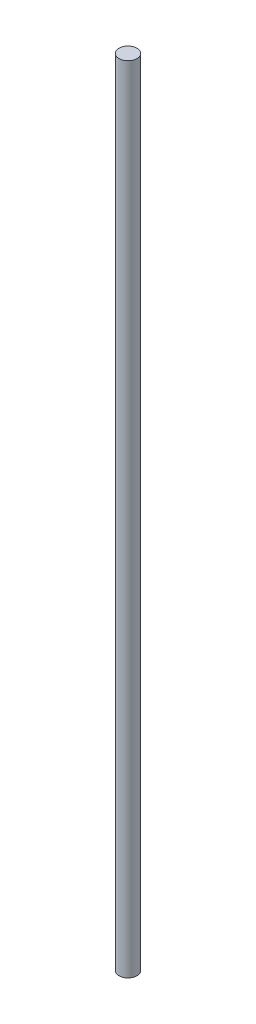
ISO-10303-21;
HEADER;
FILE_DESCRIPTION(('STEP AP214'),'2;1');
FILE_NAME('part.step','',(''),(''),'','','');
FILE_SCHEMA(('AUTOMOTIVE_DESIGN { 1 0 10303 214 1 1 1 1 }'));
ENDSEC;
DATA;
#1=APPLICATION_CONTEXT('core data for automotive mechanical design processes');
#2=APPLICATION_PROTOCOL_DEFINITION('international standard','automotive_design',2000,#1);
#3=PRODUCT_CONTEXT('',#1,'mechanical');
#4=PRODUCT('Part','Part','',(#3));
#5=PRODUCT_RELATED_PRODUCT_CATEGORY('part','',(#4));
#6=PRODUCT_DEFINITION_FORMATION('','',#4);
#7=PRODUCT_DEFINITION_CONTEXT('part definition',#1,'design');
#8=PRODUCT_DEFINITION('design','',#6,#7);
#9=PRODUCT_DEFINITION_SHAPE('','',#8);
#10=(LENGTH_UNIT() NAMED_UNIT(*) SI_UNIT(.MILLI.,.METRE.));
#11=(NAMED_UNIT(*) PLANE_ANGLE_UNIT() SI_UNIT($,.RADIAN.));
#12=(NAMED_UNIT(*) SI_UNIT($,.STERADIAN.) SOLID_ANGLE_UNIT());
#13=UNCERTAINTY_MEASURE_WITH_UNIT(LENGTH_MEASURE(1.E-05),#10,'distance_accuracy_value','');
#14=(GEOMETRIC_REPRESENTATION_CONTEXT(3) GLOBAL_UNCERTAINTY_ASSIGNED_CONTEXT((#13)) GLOBAL_UNIT_ASSIGNED_CONTEXT((#10,
#11,#12)) REPRESENTATION_CONTEXT('',''));
#15=CARTESIAN_POINT('',(0.,0.,0.));
#16=DIRECTION('',(0.,0.,1.));
#17=DIRECTION('',(1.,0.,0.));
#18=AXIS2_PLACEMENT_3D('',#15,#16,#17);
#19=CARTESIAN_POINT('',(0.,705.,0.));
#20=DIRECTION('',(0.,-1.,0.));
#21=DIRECTION('',(0.,0.,-1.));
#22=AXIS2_PLACEMENT_3D('',#19,#20,#21);
#23=CYLINDRICAL_SURFACE('',#22,8.);
#24=CARTESIAN_POINT('',(0.,705.,0.));
#25=DIRECTION('',(0.,1.,0.));
#26=DIRECTION('',(0.,0.,1.));
#27=AXIS2_PLACEMENT_3D('',#24,#25,#26);
#28=CIRCLE('',#27,8.);
#29=CARTESIAN_POINT('',(0.,705.,8.));
#30=VERTEX_POINT('',#29);
#31=EDGE_CURVE('E11',#30,#30,#28,.T.);
#32=ORIENTED_EDGE('',*,*,#31,.F.);
#33=EDGE_LOOP('',(#32));
#34=FACE_BOUND('',#33,.T.);
#35=CARTESIAN_POINT('',(0.,0.,0.));
#36=DIRECTION('',(0.,1.,0.));
#37=DIRECTION('',(0.,0.,1.));
#38=AXIS2_PLACEMENT_3D('',#35,#36,#37);
#39=CIRCLE('',#38,8.);
#40=CARTESIAN_POINT('',(0.,0.,8.));
#41=VERTEX_POINT('',#40);
#42=EDGE_CURVE('E48',#41,#41,#39,.T.);
#43=ORIENTED_EDGE('',*,*,#42,.T.);
#44=EDGE_LOOP('',(#43));
#45=FACE_BOUND('',#44,.T.);
#46=ADVANCED_FACE('F45',(#34,#45),#23,.T.);
#47=CARTESIAN_POINT('',(0.,705.,0.));
#48=DIRECTION('',(0.,1.,0.));
#49=DIRECTION('',(0.,0.,1.));
#50=AXIS2_PLACEMENT_3D('',#47,#48,#49);
#51=PLANE('',#50);
#52=ORIENTED_EDGE('',*,*,#31,.T.);
#53=EDGE_LOOP('',(#52));
#54=FACE_BOUND('',#53,.T.);
#55=ADVANCED_FACE('F78',(#54),#51,.T.);
#56=CARTESIAN_POINT('',(0.,0.,0.));
#57=DIRECTION('',(0.,1.,0.));
#58=DIRECTION('',(0.,0.,1.));
#59=AXIS2_PLACEMENT_3D('',#56,#57,#58);
#60=PLANE('',#59);
#61=CARTESIAN_POINT('',(0.,0.,0.));
#62=DIRECTION('',(0.,-1.,0.));
#63=DIRECTION('',(0.,0.,-1.));
#64=AXIS2_PLACEMENT_3D('',#61,#62,#63);
#65=CIRCLE('',#64,3.5);
#66=CARTESIAN_POINT('',(0.,0.,-3.5));
#67=VERTEX_POINT('',#66);
#68=EDGE_CURVE('E66',#67,#67,#65,.T.);
#69=ORIENTED_EDGE('',*,*,#68,.F.);
#70=EDGE_LOOP('',(#69));
#71=FACE_BOUND('',#70,.T.);
#72=ORIENTED_EDGE('',*,*,#42,.F.);
#73=EDGE_LOOP('',(#72));
#74=FACE_BOUND('',#73,.T.);
#75=ADVANCED_FACE('F59',(#71,#74),#60,.F.);
#76=CARTESIAN_POINT('',(0.,19.,0.));
#77=DIRECTION('',(0.,-1.,0.));
#78=DIRECTION('',(0.,0.,-1.));
#79=AXIS2_PLACEMENT_3D('',#76,#77,#78);
#80=CONICAL_SURFACE('',#79,3.5,1.02974425867665);
#81=CARTESIAN_POINT('',(0.,21.1030121665965,0.));
#82=VERTEX_POINT('',#81);
#83=VERTEX_LOOP('',#82);
#84=FACE_BOUND('',#83,.T.);
#85=CARTESIAN_POINT('',(0.,19.,0.));
#86=DIRECTION('',(0.,-1.,0.));
#87=DIRECTION('',(0.,0.,-1.));
#88=AXIS2_PLACEMENT_3D('',#85,#86,#87);
#89=CIRCLE('',#88,3.5);
#90=CARTESIAN_POINT('',(0.,19.,-3.5));
#91=VERTEX_POINT('',#90);
#92=EDGE_CURVE('E63',#91,#91,#89,.T.);
#93=ORIENTED_EDGE('',*,*,#92,.T.);
#94=EDGE_LOOP('',(#93));
#95=FACE_BOUND('',#94,.T.);
#96=ADVANCED_FACE('F55',(#84,#95),#80,.F.);
#97=CARTESIAN_POINT('',(0.,0.,0.));
#98=DIRECTION('',(0.,-1.,0.));
#99=DIRECTION('',(0.,0.,-1.));
#100=AXIS2_PLACEMENT_3D('',#97,#98,#99);
#101=CYLINDRICAL_SURFACE('',#100,3.5);
#102=ORIENTED_EDGE('',*,*,#92,.F.);
#103=EDGE_LOOP('',(#102));
#104=FACE_BOUND('',#103,.T.);
#105=ORIENTED_EDGE('',*,*,#68,.T.);
#106=EDGE_LOOP('',(#105));
#107=FACE_BOUND('',#106,.T.);
#108=ADVANCED_FACE('F58',(#104,#107),#101,.F.);
#109=CLOSED_SHELL('',(#46,#55,#75,#96,#108));
#110=MANIFOLD_SOLID_BREP('B2',#109);
#111=ADVANCED_BREP_SHAPE_REPRESENTATION('',(#18,#110),#14);
#112=SHAPE_DEFINITION_REPRESENTATION(#9,#111);
ENDSEC;
END-ISO-10303-21;
